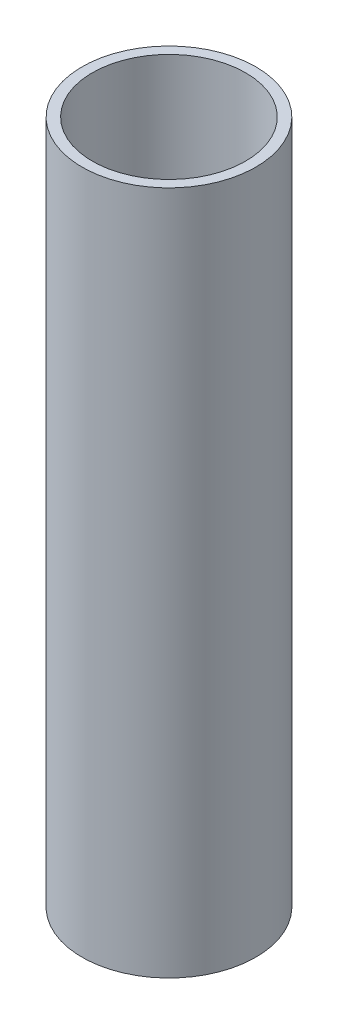
ISO-10303-21;
HEADER;
FILE_DESCRIPTION(('STEP AP214'),'2;1');
FILE_NAME('part.step','',(''),(''),'','','');
FILE_SCHEMA(('AUTOMOTIVE_DESIGN { 1 0 10303 214 1 1 1 1 }'));
ENDSEC;
DATA;
#1=APPLICATION_CONTEXT('core data for automotive mechanical design processes');
#2=APPLICATION_PROTOCOL_DEFINITION('international standard','automotive_design',2000,#1);
#3=PRODUCT_CONTEXT('',#1,'mechanical');
#4=PRODUCT('Part','Part','',(#3));
#5=PRODUCT_RELATED_PRODUCT_CATEGORY('part','',(#4));
#6=PRODUCT_DEFINITION_FORMATION('','',#4);
#7=PRODUCT_DEFINITION_CONTEXT('part definition',#1,'design');
#8=PRODUCT_DEFINITION('design','',#6,#7);
#9=PRODUCT_DEFINITION_SHAPE('','',#8);
#10=(LENGTH_UNIT() NAMED_UNIT(*) SI_UNIT(.MILLI.,.METRE.));
#11=(NAMED_UNIT(*) PLANE_ANGLE_UNIT() SI_UNIT($,.RADIAN.));
#12=(NAMED_UNIT(*) SI_UNIT($,.STERADIAN.) SOLID_ANGLE_UNIT());
#13=UNCERTAINTY_MEASURE_WITH_UNIT(LENGTH_MEASURE(1.E-05),#10,'distance_accuracy_value','');
#14=(GEOMETRIC_REPRESENTATION_CONTEXT(3) GLOBAL_UNCERTAINTY_ASSIGNED_CONTEXT((#13)) GLOBAL_UNIT_ASSIGNED_CONTEXT((#10,
#11,#12)) REPRESENTATION_CONTEXT('',''));
#15=CARTESIAN_POINT('',(0.,0.,0.));
#16=DIRECTION('',(0.,0.,1.));
#17=DIRECTION('',(1.,0.,0.));
#18=AXIS2_PLACEMENT_3D('',#15,#16,#17);
#19=CARTESIAN_POINT('',(12.7,-100.,0.));
#20=DIRECTION('',(0.,-1.,0.));
#21=DIRECTION('',(0.,0.,-1.));
#22=AXIS2_PLACEMENT_3D('',#19,#20,#21);
#23=PLANE('',#22);
#24=CARTESIAN_POINT('',(0.,-100.,0.));
#25=DIRECTION('',(0.,-1.,0.));
#26=DIRECTION('',(0.,0.,-1.));
#27=AXIS2_PLACEMENT_3D('',#24,#25,#26);
#28=CIRCLE('',#27,12.7);
#29=CARTESIAN_POINT('',(0.,-100.,-12.7));
#30=VERTEX_POINT('',#29);
#31=EDGE_CURVE('E49',#30,#30,#28,.T.);
#32=ORIENTED_EDGE('',*,*,#31,.T.);
#33=EDGE_LOOP('',(#32));
#34=FACE_BOUND('',#33,.T.);
#35=CARTESIAN_POINT('',(0.,-100.,0.));
#36=DIRECTION('',(0.,-1.,0.));
#37=DIRECTION('',(0.,0.,-1.));
#38=AXIS2_PLACEMENT_3D('',#35,#36,#37);
#39=CIRCLE('',#38,11.2);
#40=CARTESIAN_POINT('',(0.,-100.,-11.2));
#41=VERTEX_POINT('',#40);
#42=EDGE_CURVE('E10',#41,#41,#39,.T.);
#43=ORIENTED_EDGE('',*,*,#42,.F.);
#44=EDGE_LOOP('',(#43));
#45=FACE_BOUND('',#44,.T.);
#46=ADVANCED_FACE('F35',(#34,#45),#23,.T.);
#47=CARTESIAN_POINT('',(0.,-200.,0.));
#48=DIRECTION('',(0.,-1.,0.));
#49=DIRECTION('',(0.,0.,-1.));
#50=AXIS2_PLACEMENT_3D('',#47,#48,#49);
#51=CYLINDRICAL_SURFACE('',#50,11.2);
#52=ORIENTED_EDGE('',*,*,#42,.T.);
#53=EDGE_LOOP('',(#52));
#54=FACE_BOUND('',#53,.T.);
#55=CARTESIAN_POINT('',(0.,0.,0.));
#56=DIRECTION('',(0.,-1.,0.));
#57=DIRECTION('',(0.,0.,-1.));
#58=AXIS2_PLACEMENT_3D('',#55,#56,#57);
#59=CIRCLE('',#58,11.2);
#60=CARTESIAN_POINT('',(0.,0.,-11.2));
#61=VERTEX_POINT('',#60);
#62=EDGE_CURVE('E41',#61,#61,#59,.T.);
#63=ORIENTED_EDGE('',*,*,#62,.F.);
#64=EDGE_LOOP('',(#63));
#65=FACE_BOUND('',#64,.T.);
#66=ADVANCED_FACE('F65',(#54,#65),#51,.F.);
#67=CARTESIAN_POINT('',(11.2,0.,0.));
#68=DIRECTION('',(0.,1.,0.));
#69=DIRECTION('',(0.,0.,1.));
#70=AXIS2_PLACEMENT_3D('',#67,#68,#69);
#71=PLANE('',#70);
#72=ORIENTED_EDGE('',*,*,#62,.T.);
#73=EDGE_LOOP('',(#72));
#74=FACE_BOUND('',#73,.T.);
#75=CARTESIAN_POINT('',(0.,0.,0.));
#76=DIRECTION('',(0.,-1.,0.));
#77=DIRECTION('',(0.,0.,-1.));
#78=AXIS2_PLACEMENT_3D('',#75,#76,#77);
#79=CIRCLE('',#78,12.7);
#80=CARTESIAN_POINT('',(0.,0.,-12.7));
#81=VERTEX_POINT('',#80);
#82=EDGE_CURVE('E45',#81,#81,#79,.T.);
#83=ORIENTED_EDGE('',*,*,#82,.F.);
#84=EDGE_LOOP('',(#83));
#85=FACE_BOUND('',#84,.T.);
#86=ADVANCED_FACE('F59',(#74,#85),#71,.T.);
#87=CARTESIAN_POINT('',(0.,-200.,0.));
#88=DIRECTION('',(0.,-1.,0.));
#89=DIRECTION('',(0.,0.,-1.));
#90=AXIS2_PLACEMENT_3D('',#87,#88,#89);
#91=CYLINDRICAL_SURFACE('',#90,12.7);
#92=ORIENTED_EDGE('',*,*,#82,.T.);
#93=EDGE_LOOP('',(#92));
#94=FACE_BOUND('',#93,.T.);
#95=ORIENTED_EDGE('',*,*,#31,.F.);
#96=EDGE_LOOP('',(#95));
#97=FACE_BOUND('',#96,.T.);
#98=ADVANCED_FACE('F57',(#94,#97),#91,.T.);
#99=CLOSED_SHELL('',(#46,#66,#86,#98));
#100=MANIFOLD_SOLID_BREP('B2',#99);
#101=ADVANCED_BREP_SHAPE_REPRESENTATION('',(#18,#100),#14);
#102=SHAPE_DEFINITION_REPRESENTATION(#9,#101);
ENDSEC;
END-ISO-10303-21;
